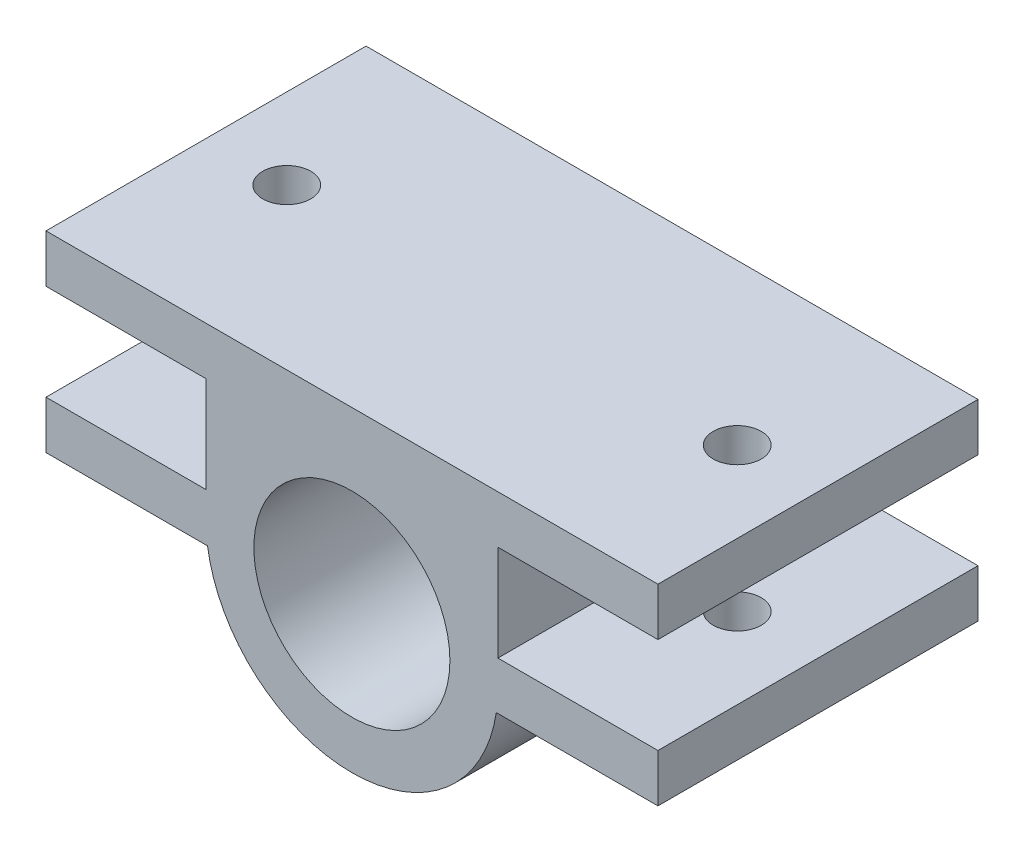
ISO-10303-21;
HEADER;
FILE_DESCRIPTION(('STEP AP214'),'2;1');
FILE_NAME('part.step','',(''),(''),'','','');
FILE_SCHEMA(('AUTOMOTIVE_DESIGN { 1 0 10303 214 1 1 1 1 }'));
ENDSEC;
DATA;
#1=APPLICATION_CONTEXT('core data for automotive mechanical design processes');
#2=APPLICATION_PROTOCOL_DEFINITION('international standard','automotive_design',2000,#1);
#3=PRODUCT_CONTEXT('',#1,'mechanical');
#4=PRODUCT('Part','Part','',(#3));
#5=PRODUCT_RELATED_PRODUCT_CATEGORY('part','',(#4));
#6=PRODUCT_DEFINITION_FORMATION('','',#4);
#7=PRODUCT_DEFINITION_CONTEXT('part definition',#1,'design');
#8=PRODUCT_DEFINITION('design','',#6,#7);
#9=PRODUCT_DEFINITION_SHAPE('','',#8);
#10=(LENGTH_UNIT() NAMED_UNIT(*) SI_UNIT(.MILLI.,.METRE.));
#11=(NAMED_UNIT(*) PLANE_ANGLE_UNIT() SI_UNIT($,.RADIAN.));
#12=(NAMED_UNIT(*) SI_UNIT($,.STERADIAN.) SOLID_ANGLE_UNIT());
#13=UNCERTAINTY_MEASURE_WITH_UNIT(LENGTH_MEASURE(1.E-05),#10,'distance_accuracy_value','');
#14=(GEOMETRIC_REPRESENTATION_CONTEXT(3) GLOBAL_UNCERTAINTY_ASSIGNED_CONTEXT((#13)) GLOBAL_UNIT_ASSIGNED_CONTEXT((#10,
#11,#12)) REPRESENTATION_CONTEXT('',''));
#15=CARTESIAN_POINT('',(0.,0.,0.));
#16=DIRECTION('',(0.,0.,1.));
#17=DIRECTION('',(1.,0.,0.));
#18=AXIS2_PLACEMENT_3D('',#15,#16,#17);
#19=CARTESIAN_POINT('',(0.,-1.35999999999999,20.));
#20=DIRECTION('',(0.,1.,0.));
#21=DIRECTION('',(0.,0.,1.));
#22=AXIS2_PLACEMENT_3D('',#19,#20,#21);
#23=PLANE('',#22);
#24=CARTESIAN_POINT('',(-14.0701343196809,-1.35999999999999,10.));
#25=DIRECTION('',(0.,1.,0.));
#26=DIRECTION('',(0.,0.,1.));
#27=AXIS2_PLACEMENT_3D('',#24,#25,#26);
#28=CIRCLE('',#27,1.5);
#29=CARTESIAN_POINT('',(-14.0701343196809,-1.35999999999999,11.5));
#30=VERTEX_POINT('',#29);
#31=EDGE_CURVE('E344',#30,#30,#28,.T.);
#32=ORIENTED_EDGE('',*,*,#31,.T.);
#33=EDGE_LOOP('',(#32));
#34=FACE_BOUND('',#33,.T.);
#35=DIRECTION('',(1.,0.,0.));
#36=VECTOR('',#35,1.);
#37=CARTESIAN_POINT('',(0.,-1.35999999999999,0.));
#38=LINE('',#37,#36);
#39=CARTESIAN_POINT('',(-19.1151343196809,-1.35999999999999,0.));
#40=VERTEX_POINT('',#39);
#41=CARTESIAN_POINT('',(-9.02308289887664,-1.35999999999999,0.));
#42=VERTEX_POINT('',#41);
#43=EDGE_CURVE('E177',#40,#42,#38,.T.);
#44=ORIENTED_EDGE('',*,*,#43,.T.);
#45=DIRECTION('',(0.,0.,-1.));
#46=VECTOR('',#45,1.);
#47=CARTESIAN_POINT('',(-9.02308289887664,-1.35999999999999,20.));
#48=LINE('',#47,#46);
#49=CARTESIAN_POINT('',(-9.02308289887664,-1.35999999999999,20.));
#50=VERTEX_POINT('',#49);
#51=EDGE_CURVE('E11',#50,#42,#48,.T.);
#52=ORIENTED_EDGE('',*,*,#51,.F.);
#53=DIRECTION('',(1.,0.,0.));
#54=VECTOR('',#53,1.);
#55=CARTESIAN_POINT('',(0.,-1.35999999999999,20.));
#56=LINE('',#55,#54);
#57=CARTESIAN_POINT('',(-19.1151343196809,-1.35999999999999,20.));
#58=VERTEX_POINT('',#57);
#59=EDGE_CURVE('E257',#58,#50,#56,.T.);
#60=ORIENTED_EDGE('',*,*,#59,.F.);
#61=DIRECTION('',(0.,0.,-1.));
#62=VECTOR('',#61,1.);
#63=CARTESIAN_POINT('',(-19.1151343196809,-1.35999999999999,20.));
#64=LINE('',#63,#62);
#65=EDGE_CURVE('E170',#58,#40,#64,.T.);
#66=ORIENTED_EDGE('',*,*,#65,.T.);
#67=EDGE_LOOP('',(#44,#52,#60,#66));
#68=FACE_BOUND('',#67,.T.);
#69=ADVANCED_FACE('F41',(#34,#68),#23,.F.);
#70=CARTESIAN_POINT('',(0.,0.,20.));
#71=DIRECTION('',(0.,0.,-1.));
#72=DIRECTION('',(-1.,0.,0.));
#73=AXIS2_PLACEMENT_3D('',#70,#71,#72);
#74=CYLINDRICAL_SURFACE('',#73,9.125);
#75=CARTESIAN_POINT('',(0.,0.,0.));
#76=DIRECTION('',(0.,0.,1.));
#77=DIRECTION('',(1.,0.,0.));
#78=AXIS2_PLACEMENT_3D('',#75,#76,#77);
#79=CIRCLE('',#78,9.125);
#80=CARTESIAN_POINT('',(9.02308289887664,-1.35999999999999,0.));
#81=VERTEX_POINT('',#80);
#82=EDGE_CURVE('E181',#42,#81,#79,.T.);
#83=ORIENTED_EDGE('',*,*,#82,.T.);
#84=DIRECTION('',(0.,0.,-1.));
#85=VECTOR('',#84,1.);
#86=CARTESIAN_POINT('',(9.02308289887664,-1.35999999999999,20.));
#87=LINE('',#86,#85);
#88=CARTESIAN_POINT('',(9.02308289887664,-1.35999999999999,20.));
#89=VERTEX_POINT('',#88);
#90=EDGE_CURVE('E51',#89,#81,#87,.T.);
#91=ORIENTED_EDGE('',*,*,#90,.F.);
#92=CARTESIAN_POINT('',(0.,0.,20.));
#93=DIRECTION('',(0.,0.,1.));
#94=DIRECTION('',(1.,0.,0.));
#95=AXIS2_PLACEMENT_3D('',#92,#93,#94);
#96=CIRCLE('',#95,9.125);
#97=EDGE_CURVE('E116',#50,#89,#96,.T.);
#98=ORIENTED_EDGE('',*,*,#97,.F.);
#99=ORIENTED_EDGE('',*,*,#51,.T.);
#100=EDGE_LOOP('',(#83,#91,#98,#99));
#101=FACE_BOUND('',#100,.T.);
#102=ADVANCED_FACE('F241',(#101),#74,.T.);
#103=CARTESIAN_POINT('',(0.,-1.35999999999999,20.));
#104=DIRECTION('',(0.,-1.,0.));
#105=DIRECTION('',(0.,0.,-1.));
#106=AXIS2_PLACEMENT_3D('',#103,#104,#105);
#107=PLANE('',#106);
#108=CARTESIAN_POINT('',(14.08,-1.35999999999999,10.));
#109=DIRECTION('',(0.,-1.,0.));
#110=DIRECTION('',(0.,0.,-1.));
#111=AXIS2_PLACEMENT_3D('',#108,#109,#110);
#112=CIRCLE('',#111,1.5);
#113=CARTESIAN_POINT('',(14.08,-1.35999999999999,8.5));
#114=VERTEX_POINT('',#113);
#115=EDGE_CURVE('E178',#114,#114,#112,.T.);
#116=ORIENTED_EDGE('',*,*,#115,.F.);
#117=EDGE_LOOP('',(#116));
#118=FACE_BOUND('',#117,.T.);
#119=DIRECTION('',(-1.,0.,0.));
#120=VECTOR('',#119,1.);
#121=CARTESIAN_POINT('',(0.,-1.35999999999999,0.));
#122=LINE('',#121,#120);
#123=CARTESIAN_POINT('',(19.125,-1.35999999999999,0.));
#124=VERTEX_POINT('',#123);
#125=EDGE_CURVE('E184',#124,#81,#122,.T.);
#126=ORIENTED_EDGE('',*,*,#125,.F.);
#127=DIRECTION('',(0.,0.,-1.));
#128=VECTOR('',#127,1.);
#129=CARTESIAN_POINT('',(19.125,-1.35999999999999,20.));
#130=LINE('',#129,#128);
#131=CARTESIAN_POINT('',(19.125,-1.35999999999999,20.));
#132=VERTEX_POINT('',#131);
#133=EDGE_CURVE('E233',#132,#124,#130,.T.);
#134=ORIENTED_EDGE('',*,*,#133,.F.);
#135=DIRECTION('',(-1.,0.,0.));
#136=VECTOR('',#135,1.);
#137=CARTESIAN_POINT('',(0.,-1.35999999999999,20.));
#138=LINE('',#137,#136);
#139=EDGE_CURVE('E240',#132,#89,#138,.T.);
#140=ORIENTED_EDGE('',*,*,#139,.T.);
#141=ORIENTED_EDGE('',*,*,#90,.T.);
#142=EDGE_LOOP('',(#126,#134,#140,#141));
#143=FACE_BOUND('',#142,.T.);
#144=ADVANCED_FACE('F238',(#118,#143),#107,.T.);
#145=CARTESIAN_POINT('',(19.125,0.,20.));
#146=DIRECTION('',(1.,0.,0.));
#147=DIRECTION('',(0.,1.,0.));
#148=AXIS2_PLACEMENT_3D('',#145,#146,#147);
#149=PLANE('',#148);
#150=DIRECTION('',(0.,-1.,0.));
#151=VECTOR('',#150,1.);
#152=CARTESIAN_POINT('',(19.125,0.,0.));
#153=LINE('',#152,#151);
#154=CARTESIAN_POINT('',(19.125,1.64000000000001,0.));
#155=VERTEX_POINT('',#154);
#156=EDGE_CURVE('E187',#155,#124,#153,.T.);
#157=ORIENTED_EDGE('',*,*,#156,.F.);
#158=DIRECTION('',(0.,0.,-1.));
#159=VECTOR('',#158,1.);
#160=CARTESIAN_POINT('',(19.125,1.64000000000001,20.));
#161=LINE('',#160,#159);
#162=CARTESIAN_POINT('',(19.125,1.64000000000001,20.));
#163=VERTEX_POINT('',#162);
#164=EDGE_CURVE('E231',#163,#155,#161,.T.);
#165=ORIENTED_EDGE('',*,*,#164,.F.);
#166=DIRECTION('',(0.,-1.,0.));
#167=VECTOR('',#166,1.);
#168=CARTESIAN_POINT('',(19.125,0.,20.));
#169=LINE('',#168,#167);
#170=EDGE_CURVE('E253',#163,#132,#169,.T.);
#171=ORIENTED_EDGE('',*,*,#170,.T.);
#172=ORIENTED_EDGE('',*,*,#133,.T.);
#173=EDGE_LOOP('',(#157,#165,#171,#172));
#174=FACE_BOUND('',#173,.T.);
#175=ADVANCED_FACE('F249',(#174),#149,.T.);
#176=CARTESIAN_POINT('',(0.,1.64000000000001,20.));
#177=DIRECTION('',(0.,-1.,0.));
#178=DIRECTION('',(1.,0.,0.));
#179=AXIS2_PLACEMENT_3D('',#176,#177,#178);
#180=PLANE('',#179);
#181=CARTESIAN_POINT('',(14.08,1.64000000000001,10.));
#182=DIRECTION('',(0.,-1.,0.));
#183=DIRECTION('',(1.,0.,0.));
#184=AXIS2_PLACEMENT_3D('',#181,#182,#183);
#185=CIRCLE('',#184,1.5);
#186=CARTESIAN_POINT('',(15.58,1.64000000000001,10.));
#187=VERTEX_POINT('',#186);
#188=EDGE_CURVE('E357',#187,#187,#185,.T.);
#189=ORIENTED_EDGE('',*,*,#188,.T.);
#190=EDGE_LOOP('',(#189));
#191=FACE_BOUND('',#190,.T.);
#192=DIRECTION('',(-1.,0.,0.));
#193=VECTOR('',#192,1.);
#194=CARTESIAN_POINT('',(0.,1.64000000000001,0.));
#195=LINE('',#194,#193);
#196=CARTESIAN_POINT('',(9.125,1.64000000000001,0.));
#197=VERTEX_POINT('',#196);
#198=EDGE_CURVE('E190',#155,#197,#195,.T.);
#199=ORIENTED_EDGE('',*,*,#198,.T.);
#200=DIRECTION('',(0.,0.,-1.));
#201=VECTOR('',#200,1.);
#202=CARTESIAN_POINT('',(9.125,1.64000000000001,20.));
#203=LINE('',#202,#201);
#204=CARTESIAN_POINT('',(9.125,1.64000000000001,20.));
#205=VERTEX_POINT('',#204);
#206=EDGE_CURVE('E229',#205,#197,#203,.T.);
#207=ORIENTED_EDGE('',*,*,#206,.F.);
#208=DIRECTION('',(-1.,0.,0.));
#209=VECTOR('',#208,1.);
#210=CARTESIAN_POINT('',(0.,1.64000000000001,20.));
#211=LINE('',#210,#209);
#212=EDGE_CURVE('E255',#163,#205,#211,.T.);
#213=ORIENTED_EDGE('',*,*,#212,.F.);
#214=ORIENTED_EDGE('',*,*,#164,.T.);
#215=EDGE_LOOP('',(#199,#207,#213,#214));
#216=FACE_BOUND('',#215,.T.);
#217=ADVANCED_FACE('F305',(#191,#216),#180,.F.);
#218=CARTESIAN_POINT('',(9.125,0.,20.));
#219=DIRECTION('',(1.,0.,0.));
#220=DIRECTION('',(0.,1.,0.));
#221=AXIS2_PLACEMENT_3D('',#218,#219,#220);
#222=PLANE('',#221);
#223=DIRECTION('',(0.,-1.,0.));
#224=VECTOR('',#223,1.);
#225=CARTESIAN_POINT('',(9.125,0.,0.));
#226=LINE('',#225,#224);
#227=CARTESIAN_POINT('',(9.125,7.64000000000002,0.));
#228=VERTEX_POINT('',#227);
#229=EDGE_CURVE('E193',#228,#197,#226,.T.);
#230=ORIENTED_EDGE('',*,*,#229,.F.);
#231=DIRECTION('',(0.,0.,-1.));
#232=VECTOR('',#231,1.);
#233=CARTESIAN_POINT('',(9.125,7.64000000000002,20.));
#234=LINE('',#233,#232);
#235=CARTESIAN_POINT('',(9.125,7.64000000000002,20.));
#236=VERTEX_POINT('',#235);
#237=EDGE_CURVE('E227',#236,#228,#234,.T.);
#238=ORIENTED_EDGE('',*,*,#237,.F.);
#239=DIRECTION('',(0.,-1.,0.));
#240=VECTOR('',#239,1.);
#241=CARTESIAN_POINT('',(9.125,0.,20.));
#242=LINE('',#241,#240);
#243=EDGE_CURVE('E262',#236,#205,#242,.T.);
#244=ORIENTED_EDGE('',*,*,#243,.T.);
#245=ORIENTED_EDGE('',*,*,#206,.T.);
#246=EDGE_LOOP('',(#230,#238,#244,#245));
#247=FACE_BOUND('',#246,.T.);
#248=ADVANCED_FACE('F308',(#247),#222,.T.);
#249=CARTESIAN_POINT('',(0.,7.64000000000002,20.));
#250=DIRECTION('',(0.,1.,0.));
#251=DIRECTION('',(0.,0.,1.));
#252=AXIS2_PLACEMENT_3D('',#249,#250,#251);
#253=PLANE('',#252);
#254=CARTESIAN_POINT('',(14.08,7.64000000000002,10.));
#255=DIRECTION('',(0.,1.,0.));
#256=DIRECTION('',(0.,0.,1.));
#257=AXIS2_PLACEMENT_3D('',#254,#255,#256);
#258=CIRCLE('',#257,1.5);
#259=CARTESIAN_POINT('',(14.08,7.64000000000002,11.5));
#260=VERTEX_POINT('',#259);
#261=EDGE_CURVE('E354',#260,#260,#258,.T.);
#262=ORIENTED_EDGE('',*,*,#261,.T.);
#263=EDGE_LOOP('',(#262));
#264=FACE_BOUND('',#263,.T.);
#265=DIRECTION('',(1.,0.,0.));
#266=VECTOR('',#265,1.);
#267=CARTESIAN_POINT('',(0.,7.64000000000002,0.));
#268=LINE('',#267,#266);
#269=CARTESIAN_POINT('',(19.125,7.64000000000002,0.));
#270=VERTEX_POINT('',#269);
#271=EDGE_CURVE('E196',#228,#270,#268,.T.);
#272=ORIENTED_EDGE('',*,*,#271,.T.);
#273=DIRECTION('',(0.,0.,-1.));
#274=VECTOR('',#273,1.);
#275=CARTESIAN_POINT('',(19.125,7.64000000000002,20.));
#276=LINE('',#275,#274);
#277=CARTESIAN_POINT('',(19.125,7.64000000000002,20.));
#278=VERTEX_POINT('',#277);
#279=EDGE_CURVE('E224',#278,#270,#276,.T.);
#280=ORIENTED_EDGE('',*,*,#279,.F.);
#281=DIRECTION('',(1.,0.,0.));
#282=VECTOR('',#281,1.);
#283=CARTESIAN_POINT('',(0.,7.64000000000002,20.));
#284=LINE('',#283,#282);
#285=EDGE_CURVE('E265',#236,#278,#284,.T.);
#286=ORIENTED_EDGE('',*,*,#285,.F.);
#287=ORIENTED_EDGE('',*,*,#237,.T.);
#288=EDGE_LOOP('',(#272,#280,#286,#287));
#289=FACE_BOUND('',#288,.T.);
#290=ADVANCED_FACE('F312',(#264,#289),#253,.F.);
#291=CARTESIAN_POINT('',(19.125,0.,20.));
#292=DIRECTION('',(-1.,0.,0.));
#293=DIRECTION('',(0.,-1.,0.));
#294=AXIS2_PLACEMENT_3D('',#291,#292,#293);
#295=PLANE('',#294);
#296=DIRECTION('',(0.,1.,0.));
#297=VECTOR('',#296,1.);
#298=CARTESIAN_POINT('',(19.125,0.,0.));
#299=LINE('',#298,#297);
#300=CARTESIAN_POINT('',(19.125,10.64,0.));
#301=VERTEX_POINT('',#300);
#302=EDGE_CURVE('E198',#270,#301,#299,.T.);
#303=ORIENTED_EDGE('',*,*,#302,.T.);
#304=DIRECTION('',(0.,0.,-1.));
#305=VECTOR('',#304,1.);
#306=CARTESIAN_POINT('',(19.125,10.64,20.));
#307=LINE('',#306,#305);
#308=CARTESIAN_POINT('',(19.125,10.64,20.));
#309=VERTEX_POINT('',#308);
#310=EDGE_CURVE('E221',#309,#301,#307,.T.);
#311=ORIENTED_EDGE('',*,*,#310,.F.);
#312=DIRECTION('',(0.,1.,0.));
#313=VECTOR('',#312,1.);
#314=CARTESIAN_POINT('',(19.125,0.,20.));
#315=LINE('',#314,#313);
#316=EDGE_CURVE('E267',#278,#309,#315,.T.);
#317=ORIENTED_EDGE('',*,*,#316,.F.);
#318=ORIENTED_EDGE('',*,*,#279,.T.);
#319=EDGE_LOOP('',(#303,#311,#317,#318));
#320=FACE_BOUND('',#319,.T.);
#321=ADVANCED_FACE('F316',(#320),#295,.F.);
#322=CARTESIAN_POINT('',(0.,10.64,20.));
#323=DIRECTION('',(0.,-1.,0.));
#324=DIRECTION('',(0.,0.,-1.));
#325=AXIS2_PLACEMENT_3D('',#322,#323,#324);
#326=PLANE('',#325);
#327=CARTESIAN_POINT('',(14.08,10.64,10.));
#328=DIRECTION('',(0.,-1.,0.));
#329=DIRECTION('',(0.,0.,-1.));
#330=AXIS2_PLACEMENT_3D('',#327,#328,#329);
#331=CIRCLE('',#330,1.5);
#332=CARTESIAN_POINT('',(14.08,10.64,8.5));
#333=VERTEX_POINT('',#332);
#334=EDGE_CURVE('E342',#333,#333,#331,.T.);
#335=ORIENTED_EDGE('',*,*,#334,.T.);
#336=EDGE_LOOP('',(#335));
#337=FACE_BOUND('',#336,.T.);
#338=CARTESIAN_POINT('',(-14.0701343196809,10.64,10.));
#339=DIRECTION('',(0.,-1.,0.));
#340=DIRECTION('',(0.,0.,-1.));
#341=AXIS2_PLACEMENT_3D('',#338,#339,#340);
#342=CIRCLE('',#341,1.5);
#343=CARTESIAN_POINT('',(-14.0701343196809,10.64,8.5));
#344=VERTEX_POINT('',#343);
#345=EDGE_CURVE('E347',#344,#344,#342,.T.);
#346=ORIENTED_EDGE('',*,*,#345,.T.);
#347=EDGE_LOOP('',(#346));
#348=FACE_BOUND('',#347,.T.);
#349=DIRECTION('',(-1.,0.,0.));
#350=VECTOR('',#349,1.);
#351=CARTESIAN_POINT('',(0.,10.64,0.));
#352=LINE('',#351,#350);
#353=CARTESIAN_POINT('',(-19.1151343196809,10.64,0.));
#354=VERTEX_POINT('',#353);
#355=EDGE_CURVE('E200',#301,#354,#352,.T.);
#356=ORIENTED_EDGE('',*,*,#355,.T.);
#357=DIRECTION('',(0.,0.,-1.));
#358=VECTOR('',#357,1.);
#359=CARTESIAN_POINT('',(-19.1151343196809,10.64,20.));
#360=LINE('',#359,#358);
#361=CARTESIAN_POINT('',(-19.1151343196809,10.64,20.));
#362=VERTEX_POINT('',#361);
#363=EDGE_CURVE('E219',#362,#354,#360,.T.);
#364=ORIENTED_EDGE('',*,*,#363,.F.);
#365=DIRECTION('',(-1.,0.,0.));
#366=VECTOR('',#365,1.);
#367=CARTESIAN_POINT('',(0.,10.64,20.));
#368=LINE('',#367,#366);
#369=EDGE_CURVE('E269',#309,#362,#368,.T.);
#370=ORIENTED_EDGE('',*,*,#369,.F.);
#371=ORIENTED_EDGE('',*,*,#310,.T.);
#372=EDGE_LOOP('',(#356,#364,#370,#371));
#373=FACE_BOUND('',#372,.T.);
#374=ADVANCED_FACE('F320',(#337,#348,#373),#326,.F.);
#375=CARTESIAN_POINT('',(-19.1151343196809,0.,20.));
#376=DIRECTION('',(-1.,0.,0.));
#377=DIRECTION('',(0.,-1.,0.));
#378=AXIS2_PLACEMENT_3D('',#375,#376,#377);
#379=PLANE('',#378);
#380=DIRECTION('',(0.,1.,0.));
#381=VECTOR('',#380,1.);
#382=CARTESIAN_POINT('',(-19.1151343196809,0.,0.));
#383=LINE('',#382,#381);
#384=CARTESIAN_POINT('',(-19.1151343196809,7.64000000000002,0.));
#385=VERTEX_POINT('',#384);
#386=EDGE_CURVE('E203',#385,#354,#383,.T.);
#387=ORIENTED_EDGE('',*,*,#386,.F.);
#388=DIRECTION('',(0.,0.,-1.));
#389=VECTOR('',#388,1.);
#390=CARTESIAN_POINT('',(-19.1151343196809,7.64000000000002,20.));
#391=LINE('',#390,#389);
#392=CARTESIAN_POINT('',(-19.1151343196809,7.64000000000002,20.));
#393=VERTEX_POINT('',#392);
#394=EDGE_CURVE('E217',#393,#385,#391,.T.);
#395=ORIENTED_EDGE('',*,*,#394,.F.);
#396=DIRECTION('',(0.,1.,0.));
#397=VECTOR('',#396,1.);
#398=CARTESIAN_POINT('',(-19.1151343196809,0.,20.));
#399=LINE('',#398,#397);
#400=EDGE_CURVE('E271',#393,#362,#399,.T.);
#401=ORIENTED_EDGE('',*,*,#400,.T.);
#402=ORIENTED_EDGE('',*,*,#363,.T.);
#403=EDGE_LOOP('',(#387,#395,#401,#402));
#404=FACE_BOUND('',#403,.T.);
#405=ADVANCED_FACE('F324',(#404),#379,.T.);
#406=CARTESIAN_POINT('',(0.,7.64000000000002,20.));
#407=DIRECTION('',(0.,-1.,0.));
#408=DIRECTION('',(0.,0.,-1.));
#409=AXIS2_PLACEMENT_3D('',#406,#407,#408);
#410=PLANE('',#409);
#411=CARTESIAN_POINT('',(-14.0701343196809,7.64000000000002,10.));
#412=DIRECTION('',(0.,-1.,0.));
#413=DIRECTION('',(0.,0.,-1.));
#414=AXIS2_PLACEMENT_3D('',#411,#412,#413);
#415=CIRCLE('',#414,1.5);
#416=CARTESIAN_POINT('',(-14.0701343196809,7.64000000000002,8.5));
#417=VERTEX_POINT('',#416);
#418=EDGE_CURVE('E341',#417,#417,#415,.T.);
#419=ORIENTED_EDGE('',*,*,#418,.F.);
#420=EDGE_LOOP('',(#419));
#421=FACE_BOUND('',#420,.T.);
#422=DIRECTION('',(-1.,0.,0.));
#423=VECTOR('',#422,1.);
#424=CARTESIAN_POINT('',(0.,7.64000000000002,0.));
#425=LINE('',#424,#423);
#426=CARTESIAN_POINT('',(-9.11513431968089,7.64000000000002,0.));
#427=VERTEX_POINT('',#426);
#428=EDGE_CURVE('E206',#427,#385,#425,.T.);
#429=ORIENTED_EDGE('',*,*,#428,.F.);
#430=DIRECTION('',(0.,0.,-1.));
#431=VECTOR('',#430,1.);
#432=CARTESIAN_POINT('',(-9.11513431968089,7.64000000000002,20.));
#433=LINE('',#432,#431);
#434=CARTESIAN_POINT('',(-9.11513431968089,7.64000000000002,20.));
#435=VERTEX_POINT('',#434);
#436=EDGE_CURVE('E166',#435,#427,#433,.T.);
#437=ORIENTED_EDGE('',*,*,#436,.F.);
#438=DIRECTION('',(-1.,0.,0.));
#439=VECTOR('',#438,1.);
#440=CARTESIAN_POINT('',(0.,7.64000000000002,20.));
#441=LINE('',#440,#439);
#442=EDGE_CURVE('E155',#435,#393,#441,.T.);
#443=ORIENTED_EDGE('',*,*,#442,.T.);
#444=ORIENTED_EDGE('',*,*,#394,.T.);
#445=EDGE_LOOP('',(#429,#437,#443,#444));
#446=FACE_BOUND('',#445,.T.);
#447=ADVANCED_FACE('F275',(#421,#446),#410,.T.);
#448=CARTESIAN_POINT('',(-9.11513431968089,0.,20.));
#449=DIRECTION('',(1.,0.,0.));
#450=DIRECTION('',(0.,1.,0.));
#451=AXIS2_PLACEMENT_3D('',#448,#449,#450);
#452=PLANE('',#451);
#453=DIRECTION('',(0.,-1.,0.));
#454=VECTOR('',#453,1.);
#455=CARTESIAN_POINT('',(-9.11513431968089,0.,0.));
#456=LINE('',#455,#454);
#457=CARTESIAN_POINT('',(-9.11513431968089,1.64000000000001,0.));
#458=VERTEX_POINT('',#457);
#459=EDGE_CURVE('E162',#427,#458,#456,.T.);
#460=ORIENTED_EDGE('',*,*,#459,.T.);
#461=DIRECTION('',(0.,0.,-1.));
#462=VECTOR('',#461,1.);
#463=CARTESIAN_POINT('',(-9.11513431968089,1.64000000000001,20.));
#464=LINE('',#463,#462);
#465=CARTESIAN_POINT('',(-9.11513431968089,1.64000000000001,20.));
#466=VERTEX_POINT('',#465);
#467=EDGE_CURVE('E159',#466,#458,#464,.T.);
#468=ORIENTED_EDGE('',*,*,#467,.F.);
#469=DIRECTION('',(0.,-1.,0.));
#470=VECTOR('',#469,1.);
#471=CARTESIAN_POINT('',(-9.11513431968089,0.,20.));
#472=LINE('',#471,#470);
#473=EDGE_CURVE('E148',#435,#466,#472,.T.);
#474=ORIENTED_EDGE('',*,*,#473,.F.);
#475=ORIENTED_EDGE('',*,*,#436,.T.);
#476=EDGE_LOOP('',(#460,#468,#474,#475));
#477=FACE_BOUND('',#476,.T.);
#478=ADVANCED_FACE('F160',(#477),#452,.F.);
#479=CARTESIAN_POINT('',(0.,1.64000000000001,20.));
#480=DIRECTION('',(0.,1.,0.));
#481=DIRECTION('',(-1.,0.,0.));
#482=AXIS2_PLACEMENT_3D('',#479,#480,#481);
#483=PLANE('',#482);
#484=CARTESIAN_POINT('',(-14.0701343196809,1.64000000000001,10.));
#485=DIRECTION('',(0.,1.,0.));
#486=DIRECTION('',(-1.,0.,0.));
#487=AXIS2_PLACEMENT_3D('',#484,#485,#486);
#488=CIRCLE('',#487,1.5);
#489=CARTESIAN_POINT('',(-15.5701343196809,1.64000000000001,10.));
#490=VERTEX_POINT('',#489);
#491=EDGE_CURVE('E45',#490,#490,#488,.T.);
#492=ORIENTED_EDGE('',*,*,#491,.F.);
#493=EDGE_LOOP('',(#492));
#494=FACE_BOUND('',#493,.T.);
#495=DIRECTION('',(1.,0.,0.));
#496=VECTOR('',#495,1.);
#497=CARTESIAN_POINT('',(0.,1.64000000000001,0.));
#498=LINE('',#497,#496);
#499=CARTESIAN_POINT('',(-19.1151343196809,1.64000000000001,0.));
#500=VERTEX_POINT('',#499);
#501=EDGE_CURVE('E210',#500,#458,#498,.T.);
#502=ORIENTED_EDGE('',*,*,#501,.F.);
#503=DIRECTION('',(0.,0.,-1.));
#504=VECTOR('',#503,1.);
#505=CARTESIAN_POINT('',(-19.1151343196809,1.64000000000001,20.));
#506=LINE('',#505,#504);
#507=CARTESIAN_POINT('',(-19.1151343196809,1.64000000000001,20.));
#508=VERTEX_POINT('',#507);
#509=EDGE_CURVE('E105',#508,#500,#506,.T.);
#510=ORIENTED_EDGE('',*,*,#509,.F.);
#511=DIRECTION('',(1.,0.,0.));
#512=VECTOR('',#511,1.);
#513=CARTESIAN_POINT('',(0.,1.64000000000001,20.));
#514=LINE('',#513,#512);
#515=EDGE_CURVE('E152',#508,#466,#514,.T.);
#516=ORIENTED_EDGE('',*,*,#515,.T.);
#517=ORIENTED_EDGE('',*,*,#467,.T.);
#518=EDGE_LOOP('',(#502,#510,#516,#517));
#519=FACE_BOUND('',#518,.T.);
#520=ADVANCED_FACE('F168',(#494,#519),#483,.T.);
#521=CARTESIAN_POINT('',(0.,0.,20.));
#522=DIRECTION('',(0.,0.,-1.));
#523=DIRECTION('',(-1.,0.,0.));
#524=AXIS2_PLACEMENT_3D('',#521,#522,#523);
#525=CYLINDRICAL_SURFACE('',#524,6.125);
#526=CARTESIAN_POINT('',(0.,0.,20.));
#527=DIRECTION('',(0.,0.,1.));
#528=DIRECTION('',(1.,0.,0.));
#529=AXIS2_PLACEMENT_3D('',#526,#527,#528);
#530=CIRCLE('',#529,6.125);
#531=CARTESIAN_POINT('',(6.125,0.,20.));
#532=VERTEX_POINT('',#531);
#533=EDGE_CURVE('E213',#532,#532,#530,.T.);
#534=ORIENTED_EDGE('',*,*,#533,.T.);
#535=EDGE_LOOP('',(#534));
#536=FACE_BOUND('',#535,.T.);
#537=CARTESIAN_POINT('',(0.,0.,0.));
#538=DIRECTION('',(0.,0.,1.));
#539=DIRECTION('',(1.,0.,0.));
#540=AXIS2_PLACEMENT_3D('',#537,#538,#539);
#541=CIRCLE('',#540,6.125);
#542=CARTESIAN_POINT('',(6.125,0.,0.));
#543=VERTEX_POINT('',#542);
#544=EDGE_CURVE('E174',#543,#543,#541,.T.);
#545=ORIENTED_EDGE('',*,*,#544,.F.);
#546=EDGE_LOOP('',(#545));
#547=FACE_BOUND('',#546,.T.);
#548=ADVANCED_FACE('F43',(#536,#547),#525,.F.);
#549=CARTESIAN_POINT('',(-19.1151343196809,0.,20.));
#550=DIRECTION('',(1.,0.,0.));
#551=DIRECTION('',(0.,1.,0.));
#552=AXIS2_PLACEMENT_3D('',#549,#550,#551);
#553=PLANE('',#552);
#554=DIRECTION('',(0.,-1.,0.));
#555=VECTOR('',#554,1.);
#556=CARTESIAN_POINT('',(-19.1151343196809,0.,0.));
#557=LINE('',#556,#555);
#558=EDGE_CURVE('E108',#500,#40,#557,.T.);
#559=ORIENTED_EDGE('',*,*,#558,.T.);
#560=ORIENTED_EDGE('',*,*,#65,.F.);
#561=DIRECTION('',(0.,-1.,0.));
#562=VECTOR('',#561,1.);
#563=CARTESIAN_POINT('',(-19.1151343196809,0.,20.));
#564=LINE('',#563,#562);
#565=EDGE_CURVE('E59',#508,#58,#564,.T.);
#566=ORIENTED_EDGE('',*,*,#565,.F.);
#567=ORIENTED_EDGE('',*,*,#509,.T.);
#568=EDGE_LOOP('',(#559,#560,#566,#567));
#569=FACE_BOUND('',#568,.T.);
#570=ADVANCED_FACE('F279',(#569),#553,.F.);
#571=CARTESIAN_POINT('',(0.,0.,20.));
#572=DIRECTION('',(0.,0.,1.));
#573=DIRECTION('',(1.,0.,0.));
#574=AXIS2_PLACEMENT_3D('',#571,#572,#573);
#575=PLANE('',#574);
#576=ORIENTED_EDGE('',*,*,#533,.F.);
#577=EDGE_LOOP('',(#576));
#578=FACE_BOUND('',#577,.T.);
#579=ORIENTED_EDGE('',*,*,#59,.T.);
#580=ORIENTED_EDGE('',*,*,#97,.T.);
#581=ORIENTED_EDGE('',*,*,#139,.F.);
#582=ORIENTED_EDGE('',*,*,#170,.F.);
#583=ORIENTED_EDGE('',*,*,#212,.T.);
#584=ORIENTED_EDGE('',*,*,#243,.F.);
#585=ORIENTED_EDGE('',*,*,#285,.T.);
#586=ORIENTED_EDGE('',*,*,#316,.T.);
#587=ORIENTED_EDGE('',*,*,#369,.T.);
#588=ORIENTED_EDGE('',*,*,#400,.F.);
#589=ORIENTED_EDGE('',*,*,#442,.F.);
#590=ORIENTED_EDGE('',*,*,#473,.T.);
#591=ORIENTED_EDGE('',*,*,#515,.F.);
#592=ORIENTED_EDGE('',*,*,#565,.T.);
#593=EDGE_LOOP('',(#579,#580,#581,#582,#583,#584,#585,#586,#587,#588,#589,#590,#591,#592));
#594=FACE_BOUND('',#593,.T.);
#595=ADVANCED_FACE('F150',(#578,#594),#575,.T.);
#596=CARTESIAN_POINT('',(0.,0.,0.));
#597=DIRECTION('',(0.,0.,1.));
#598=DIRECTION('',(1.,0.,0.));
#599=AXIS2_PLACEMENT_3D('',#596,#597,#598);
#600=PLANE('',#599);
#601=ORIENTED_EDGE('',*,*,#544,.T.);
#602=EDGE_LOOP('',(#601));
#603=FACE_BOUND('',#602,.T.);
#604=ORIENTED_EDGE('',*,*,#43,.F.);
#605=ORIENTED_EDGE('',*,*,#558,.F.);
#606=ORIENTED_EDGE('',*,*,#501,.T.);
#607=ORIENTED_EDGE('',*,*,#459,.F.);
#608=ORIENTED_EDGE('',*,*,#428,.T.);
#609=ORIENTED_EDGE('',*,*,#386,.T.);
#610=ORIENTED_EDGE('',*,*,#355,.F.);
#611=ORIENTED_EDGE('',*,*,#302,.F.);
#612=ORIENTED_EDGE('',*,*,#271,.F.);
#613=ORIENTED_EDGE('',*,*,#229,.T.);
#614=ORIENTED_EDGE('',*,*,#198,.F.);
#615=ORIENTED_EDGE('',*,*,#156,.T.);
#616=ORIENTED_EDGE('',*,*,#125,.T.);
#617=ORIENTED_EDGE('',*,*,#82,.F.);
#618=EDGE_LOOP('',(#604,#605,#606,#607,#608,#609,#610,#611,#612,#613,#614,#615,#616,#617));
#619=FACE_BOUND('',#618,.T.);
#620=ADVANCED_FACE('F245',(#603,#619),#600,.F.);
#621=CARTESIAN_POINT('',(-14.0701343196809,10.64,10.));
#622=DIRECTION('',(0.,-1.,0.));
#623=DIRECTION('',(0.,0.,-1.));
#624=AXIS2_PLACEMENT_3D('',#621,#622,#623);
#625=CYLINDRICAL_SURFACE('',#624,1.5);
#626=ORIENTED_EDGE('',*,*,#491,.T.);
#627=EDGE_LOOP('',(#626));
#628=FACE_BOUND('',#627,.T.);
#629=ORIENTED_EDGE('',*,*,#31,.F.);
#630=EDGE_LOOP('',(#629));
#631=FACE_BOUND('',#630,.T.);
#632=ADVANCED_FACE('F367',(#628,#631),#625,.F.);
#633=ORIENTED_EDGE('',*,*,#418,.T.);
#634=EDGE_LOOP('',(#633));
#635=FACE_BOUND('',#634,.T.);
#636=ORIENTED_EDGE('',*,*,#345,.F.);
#637=EDGE_LOOP('',(#636));
#638=FACE_BOUND('',#637,.T.);
#639=ADVANCED_FACE('F370',(#635,#638),#625,.F.);
#640=CARTESIAN_POINT('',(14.08,10.64,10.));
#641=DIRECTION('',(0.,-1.,0.));
#642=DIRECTION('',(0.,0.,-1.));
#643=AXIS2_PLACEMENT_3D('',#640,#641,#642);
#644=CYLINDRICAL_SURFACE('',#643,1.5);
#645=ORIENTED_EDGE('',*,*,#334,.F.);
#646=EDGE_LOOP('',(#645));
#647=FACE_BOUND('',#646,.T.);
#648=ORIENTED_EDGE('',*,*,#261,.F.);
#649=EDGE_LOOP('',(#648));
#650=FACE_BOUND('',#649,.T.);
#651=ADVANCED_FACE('F375',(#647,#650),#644,.F.);
#652=ORIENTED_EDGE('',*,*,#115,.T.);
#653=EDGE_LOOP('',(#652));
#654=FACE_BOUND('',#653,.T.);
#655=ORIENTED_EDGE('',*,*,#188,.F.);
#656=EDGE_LOOP('',(#655));
#657=FACE_BOUND('',#656,.T.);
#658=ADVANCED_FACE('F373',(#654,#657),#644,.F.);
#659=CLOSED_SHELL('',(#69,#102,#144,#175,#217,#248,#290,#321,#374,#405,#447,#478,#520,#548,#570,
#595,#620,#632,#639,#651,#658));
#660=MANIFOLD_SOLID_BREP('B2',#659);
#661=ADVANCED_BREP_SHAPE_REPRESENTATION('',(#18,#660),#14);
#662=SHAPE_DEFINITION_REPRESENTATION(#9,#661);
ENDSEC;
END-ISO-10303-21;
